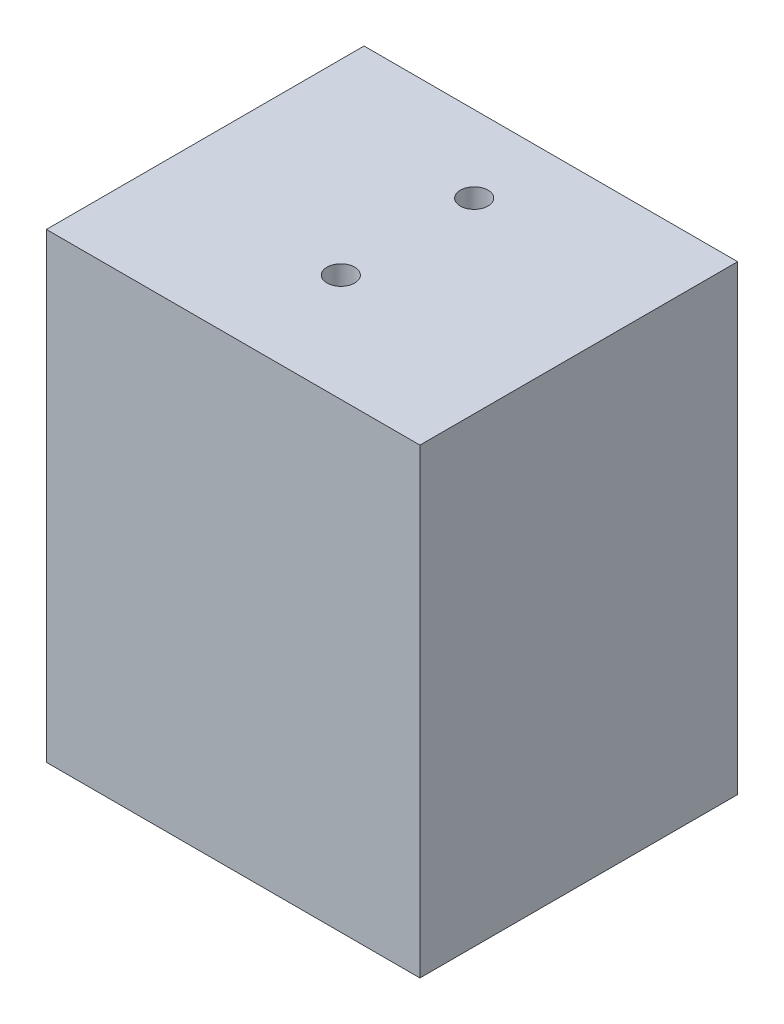
ISO-10303-21;
HEADER;
FILE_DESCRIPTION(('STEP AP214'),'2;1');
FILE_NAME('part.step','',(''),(''),'','','');
FILE_SCHEMA(('AUTOMOTIVE_DESIGN { 1 0 10303 214 1 1 1 1 }'));
ENDSEC;
DATA;
#1=APPLICATION_CONTEXT('core data for automotive mechanical design processes');
#2=APPLICATION_PROTOCOL_DEFINITION('international standard','automotive_design',2000,#1);
#3=PRODUCT_CONTEXT('',#1,'mechanical');
#4=PRODUCT('Part','Part','',(#3));
#5=PRODUCT_RELATED_PRODUCT_CATEGORY('part','',(#4));
#6=PRODUCT_DEFINITION_FORMATION('','',#4);
#7=PRODUCT_DEFINITION_CONTEXT('part definition',#1,'design');
#8=PRODUCT_DEFINITION('design','',#6,#7);
#9=PRODUCT_DEFINITION_SHAPE('','',#8);
#10=(LENGTH_UNIT() NAMED_UNIT(*) SI_UNIT(.MILLI.,.METRE.));
#11=(NAMED_UNIT(*) PLANE_ANGLE_UNIT() SI_UNIT($,.RADIAN.));
#12=(NAMED_UNIT(*) SI_UNIT($,.STERADIAN.) SOLID_ANGLE_UNIT());
#13=UNCERTAINTY_MEASURE_WITH_UNIT(LENGTH_MEASURE(1.E-05),#10,'distance_accuracy_value','');
#14=(GEOMETRIC_REPRESENTATION_CONTEXT(3) GLOBAL_UNCERTAINTY_ASSIGNED_CONTEXT((#13)) GLOBAL_UNIT_ASSIGNED_CONTEXT((#10,
#11,#12)) REPRESENTATION_CONTEXT('',''));
#15=CARTESIAN_POINT('',(0.,0.,0.));
#16=DIRECTION('',(0.,0.,1.));
#17=DIRECTION('',(1.,0.,0.));
#18=AXIS2_PLACEMENT_3D('',#15,#16,#17);
#19=CARTESIAN_POINT('',(-47.3268362253387,15.1290705966247,40.2));
#20=DIRECTION('',(1.,0.,0.));
#21=DIRECTION('',(0.,0.,-1.));
#22=AXIS2_PLACEMENT_3D('',#19,#20,#21);
#23=PLANE('',#22);
#24=DIRECTION('',(0.,-1.,0.));
#25=VECTOR('',#24,1.);
#26=CARTESIAN_POINT('',(-47.3268362253387,15.1290705966247,0.));
#27=LINE('',#26,#25);
#28=CARTESIAN_POINT('',(-47.3268362253387,15.1290705966247,0.));
#29=VERTEX_POINT('',#28);
#30=CARTESIAN_POINT('',(-47.3268362253387,-43.2709294033753,0.));
#31=VERTEX_POINT('',#30);
#32=EDGE_CURVE('E99',#29,#31,#27,.T.);
#33=ORIENTED_EDGE('',*,*,#32,.T.);
#34=DIRECTION('',(0.,0.,-1.));
#35=VECTOR('',#34,1.);
#36=CARTESIAN_POINT('',(-47.3268362253387,-43.2709294033753,40.2));
#37=LINE('',#36,#35);
#38=CARTESIAN_POINT('',(-47.3268362253387,-43.2709294033753,40.2));
#39=VERTEX_POINT('',#38);
#40=EDGE_CURVE('E11',#39,#31,#37,.T.);
#41=ORIENTED_EDGE('',*,*,#40,.F.);
#42=DIRECTION('',(0.,-1.,0.));
#43=VECTOR('',#42,1.);
#44=CARTESIAN_POINT('',(-47.3268362253387,15.1290705966247,40.2));
#45=LINE('',#44,#43);
#46=CARTESIAN_POINT('',(-47.3268362253387,15.1290705966247,40.2));
#47=VERTEX_POINT('',#46);
#48=EDGE_CURVE('E86',#47,#39,#45,.T.);
#49=ORIENTED_EDGE('',*,*,#48,.F.);
#50=DIRECTION('',(0.,0.,-1.));
#51=VECTOR('',#50,1.);
#52=CARTESIAN_POINT('',(-47.3268362253387,15.1290705966247,40.2));
#53=LINE('',#52,#51);
#54=EDGE_CURVE('E95',#47,#29,#53,.T.);
#55=ORIENTED_EDGE('',*,*,#54,.T.);
#56=EDGE_LOOP('',(#33,#41,#49,#55));
#57=FACE_BOUND('',#56,.T.);
#58=ADVANCED_FACE('F33',(#57),#23,.F.);
#59=CARTESIAN_POINT('',(-47.3268362253387,-43.2709294033753,40.2));
#60=DIRECTION('',(0.,1.,0.));
#61=DIRECTION('',(0.,0.,1.));
#62=AXIS2_PLACEMENT_3D('',#59,#60,#61);
#63=PLANE('',#62);
#64=CARTESIAN_POINT('',(-23.6918362253387,-43.2709294033753,9.70221851751063));
#65=DIRECTION('',(0.,-1.,0.));
#66=DIRECTION('',(0.,0.,-1.));
#67=AXIS2_PLACEMENT_3D('',#64,#65,#66);
#68=CIRCLE('',#67,1.75);
#69=CARTESIAN_POINT('',(-23.6918362253387,-43.2709294033753,7.95221851751063));
#70=VERTEX_POINT('',#69);
#71=EDGE_CURVE('E108',#70,#70,#68,.T.);
#72=ORIENTED_EDGE('',*,*,#71,.F.);
#73=EDGE_LOOP('',(#72));
#74=FACE_BOUND('',#73,.T.);
#75=CARTESIAN_POINT('',(-23.6918362253387,-43.2709294033753,26.5737153936314));
#76=DIRECTION('',(0.,-1.,0.));
#77=DIRECTION('',(0.,0.,-1.));
#78=AXIS2_PLACEMENT_3D('',#75,#76,#77);
#79=CIRCLE('',#78,1.75);
#80=CARTESIAN_POINT('',(-23.6918362253387,-43.2709294033753,24.8237153936314));
#81=VERTEX_POINT('',#80);
#82=EDGE_CURVE('E113',#81,#81,#79,.T.);
#83=ORIENTED_EDGE('',*,*,#82,.F.);
#84=EDGE_LOOP('',(#83));
#85=FACE_BOUND('',#84,.T.);
#86=DIRECTION('',(1.,0.,0.));
#87=VECTOR('',#86,1.);
#88=CARTESIAN_POINT('',(-47.3268362253387,-43.2709294033753,0.));
#89=LINE('',#88,#87);
#90=CARTESIAN_POINT('',(-0.0568362253386967,-43.2709294033753,0.));
#91=VERTEX_POINT('',#90);
#92=EDGE_CURVE('E90',#31,#91,#89,.T.);
#93=ORIENTED_EDGE('',*,*,#92,.T.);
#94=DIRECTION('',(0.,0.,-1.));
#95=VECTOR('',#94,1.);
#96=CARTESIAN_POINT('',(-0.0568362253386967,-43.2709294033753,40.2));
#97=LINE('',#96,#95);
#98=CARTESIAN_POINT('',(-0.0568362253386967,-43.2709294033753,40.2));
#99=VERTEX_POINT('',#98);
#100=EDGE_CURVE('E42',#99,#91,#97,.T.);
#101=ORIENTED_EDGE('',*,*,#100,.F.);
#102=DIRECTION('',(1.,0.,0.));
#103=VECTOR('',#102,1.);
#104=CARTESIAN_POINT('',(-47.3268362253387,-43.2709294033753,40.2));
#105=LINE('',#104,#103);
#106=EDGE_CURVE('E81',#39,#99,#105,.T.);
#107=ORIENTED_EDGE('',*,*,#106,.F.);
#108=ORIENTED_EDGE('',*,*,#40,.T.);
#109=EDGE_LOOP('',(#93,#101,#107,#108));
#110=FACE_BOUND('',#109,.T.);
#111=ADVANCED_FACE('F89',(#74,#85,#110),#63,.F.);
#112=CARTESIAN_POINT('',(-0.0568362253386967,15.1290705966247,40.2));
#113=DIRECTION('',(-1.,0.,0.));
#114=DIRECTION('',(0.,0.,1.));
#115=AXIS2_PLACEMENT_3D('',#112,#113,#114);
#116=PLANE('',#115);
#117=DIRECTION('',(0.,1.,0.));
#118=VECTOR('',#117,1.);
#119=CARTESIAN_POINT('',(-0.0568362253386967,15.1290705966247,0.));
#120=LINE('',#119,#118);
#121=CARTESIAN_POINT('',(-0.0568362253386967,15.1290705966247,0.));
#122=VERTEX_POINT('',#121);
#123=EDGE_CURVE('E68',#91,#122,#120,.T.);
#124=ORIENTED_EDGE('',*,*,#123,.T.);
#125=DIRECTION('',(0.,0.,-1.));
#126=VECTOR('',#125,1.);
#127=CARTESIAN_POINT('',(-0.0568362253386967,15.1290705966247,40.2));
#128=LINE('',#127,#126);
#129=CARTESIAN_POINT('',(-0.0568362253386967,15.1290705966247,40.2));
#130=VERTEX_POINT('',#129);
#131=EDGE_CURVE('E91',#130,#122,#128,.T.);
#132=ORIENTED_EDGE('',*,*,#131,.F.);
#133=DIRECTION('',(0.,1.,0.));
#134=VECTOR('',#133,1.);
#135=CARTESIAN_POINT('',(-0.0568362253386967,15.1290705966247,40.2));
#136=LINE('',#135,#134);
#137=EDGE_CURVE('E84',#99,#130,#136,.T.);
#138=ORIENTED_EDGE('',*,*,#137,.F.);
#139=ORIENTED_EDGE('',*,*,#100,.T.);
#140=EDGE_LOOP('',(#124,#132,#138,#139));
#141=FACE_BOUND('',#140,.T.);
#142=ADVANCED_FACE('F93',(#141),#116,.F.);
#143=CARTESIAN_POINT('',(-47.3268362253387,15.1290705966247,40.2));
#144=DIRECTION('',(0.,-1.,0.));
#145=DIRECTION('',(0.,0.,-1.));
#146=AXIS2_PLACEMENT_3D('',#143,#144,#145);
#147=PLANE('',#146);
#148=CARTESIAN_POINT('',(-23.6918362253387,15.1290705966247,9.70221851751063));
#149=DIRECTION('',(0.,-1.,0.));
#150=DIRECTION('',(0.,0.,-1.));
#151=AXIS2_PLACEMENT_3D('',#148,#149,#150);
#152=CIRCLE('',#151,1.75);
#153=CARTESIAN_POINT('',(-23.6918362253387,15.1290705966247,7.95221851751063));
#154=VERTEX_POINT('',#153);
#155=EDGE_CURVE('E36',#154,#154,#152,.T.);
#156=ORIENTED_EDGE('',*,*,#155,.T.);
#157=EDGE_LOOP('',(#156));
#158=FACE_BOUND('',#157,.T.);
#159=CARTESIAN_POINT('',(-23.6918362253387,15.1290705966247,26.5737153936314));
#160=DIRECTION('',(0.,-1.,0.));
#161=DIRECTION('',(0.,0.,-1.));
#162=AXIS2_PLACEMENT_3D('',#159,#160,#161);
#163=CIRCLE('',#162,1.75);
#164=CARTESIAN_POINT('',(-23.6918362253387,15.1290705966247,24.8237153936314));
#165=VERTEX_POINT('',#164);
#166=EDGE_CURVE('E106',#165,#165,#163,.T.);
#167=ORIENTED_EDGE('',*,*,#166,.T.);
#168=EDGE_LOOP('',(#167));
#169=FACE_BOUND('',#168,.T.);
#170=DIRECTION('',(-1.,0.,0.));
#171=VECTOR('',#170,1.);
#172=CARTESIAN_POINT('',(-47.3268362253387,15.1290705966247,0.));
#173=LINE('',#172,#171);
#174=EDGE_CURVE('E74',#122,#29,#173,.T.);
#175=ORIENTED_EDGE('',*,*,#174,.T.);
#176=ORIENTED_EDGE('',*,*,#54,.F.);
#177=DIRECTION('',(-1.,0.,0.));
#178=VECTOR('',#177,1.);
#179=CARTESIAN_POINT('',(-47.3268362253387,15.1290705966247,40.2));
#180=LINE('',#179,#178);
#181=EDGE_CURVE('E51',#130,#47,#180,.T.);
#182=ORIENTED_EDGE('',*,*,#181,.F.);
#183=ORIENTED_EDGE('',*,*,#131,.T.);
#184=EDGE_LOOP('',(#175,#176,#182,#183));
#185=FACE_BOUND('',#184,.T.);
#186=ADVANCED_FACE('F130',(#158,#169,#185),#147,.F.);
#187=CARTESIAN_POINT('',(0.,0.,40.2));
#188=DIRECTION('',(0.,0.,1.));
#189=DIRECTION('',(1.,0.,0.));
#190=AXIS2_PLACEMENT_3D('',#187,#188,#189);
#191=PLANE('',#190);
#192=ORIENTED_EDGE('',*,*,#48,.T.);
#193=ORIENTED_EDGE('',*,*,#106,.T.);
#194=ORIENTED_EDGE('',*,*,#137,.T.);
#195=ORIENTED_EDGE('',*,*,#181,.T.);
#196=EDGE_LOOP('',(#192,#193,#194,#195));
#197=FACE_BOUND('',#196,.T.);
#198=ADVANCED_FACE('F82',(#197),#191,.T.);
#199=CARTESIAN_POINT('',(0.,0.,0.));
#200=DIRECTION('',(0.,0.,1.));
#201=DIRECTION('',(1.,0.,0.));
#202=AXIS2_PLACEMENT_3D('',#199,#200,#201);
#203=PLANE('',#202);
#204=ORIENTED_EDGE('',*,*,#32,.F.);
#205=ORIENTED_EDGE('',*,*,#174,.F.);
#206=ORIENTED_EDGE('',*,*,#123,.F.);
#207=ORIENTED_EDGE('',*,*,#92,.F.);
#208=EDGE_LOOP('',(#204,#205,#206,#207));
#209=FACE_BOUND('',#208,.T.);
#210=ADVANCED_FACE('F137',(#209),#203,.F.);
#211=CARTESIAN_POINT('',(-23.6918362253387,16.7290705966247,26.5737153936314));
#212=DIRECTION('',(0.,-1.,0.));
#213=DIRECTION('',(0.,0.,-1.));
#214=AXIS2_PLACEMENT_3D('',#211,#212,#213);
#215=CYLINDRICAL_SURFACE('',#214,1.75);
#216=ORIENTED_EDGE('',*,*,#82,.T.);
#217=EDGE_LOOP('',(#216));
#218=FACE_BOUND('',#217,.T.);
#219=ORIENTED_EDGE('',*,*,#166,.F.);
#220=EDGE_LOOP('',(#219));
#221=FACE_BOUND('',#220,.T.);
#222=ADVANCED_FACE('F121',(#218,#221),#215,.F.);
#223=CARTESIAN_POINT('',(-23.6918362253387,16.7290705966247,9.70221851751063));
#224=DIRECTION('',(0.,-1.,0.));
#225=DIRECTION('',(0.,0.,-1.));
#226=AXIS2_PLACEMENT_3D('',#223,#224,#225);
#227=CYLINDRICAL_SURFACE('',#226,1.75);
#228=ORIENTED_EDGE('',*,*,#71,.T.);
#229=EDGE_LOOP('',(#228));
#230=FACE_BOUND('',#229,.T.);
#231=ORIENTED_EDGE('',*,*,#155,.F.);
#232=EDGE_LOOP('',(#231));
#233=FACE_BOUND('',#232,.T.);
#234=ADVANCED_FACE('F145',(#230,#233),#227,.F.);
#235=CLOSED_SHELL('',(#58,#111,#142,#186,#198,#210,#222,#234));
#236=MANIFOLD_SOLID_BREP('B2',#235);
#237=ADVANCED_BREP_SHAPE_REPRESENTATION('',(#18,#236),#14);
#238=SHAPE_DEFINITION_REPRESENTATION(#9,#237);
ENDSEC;
END-ISO-10303-21;
